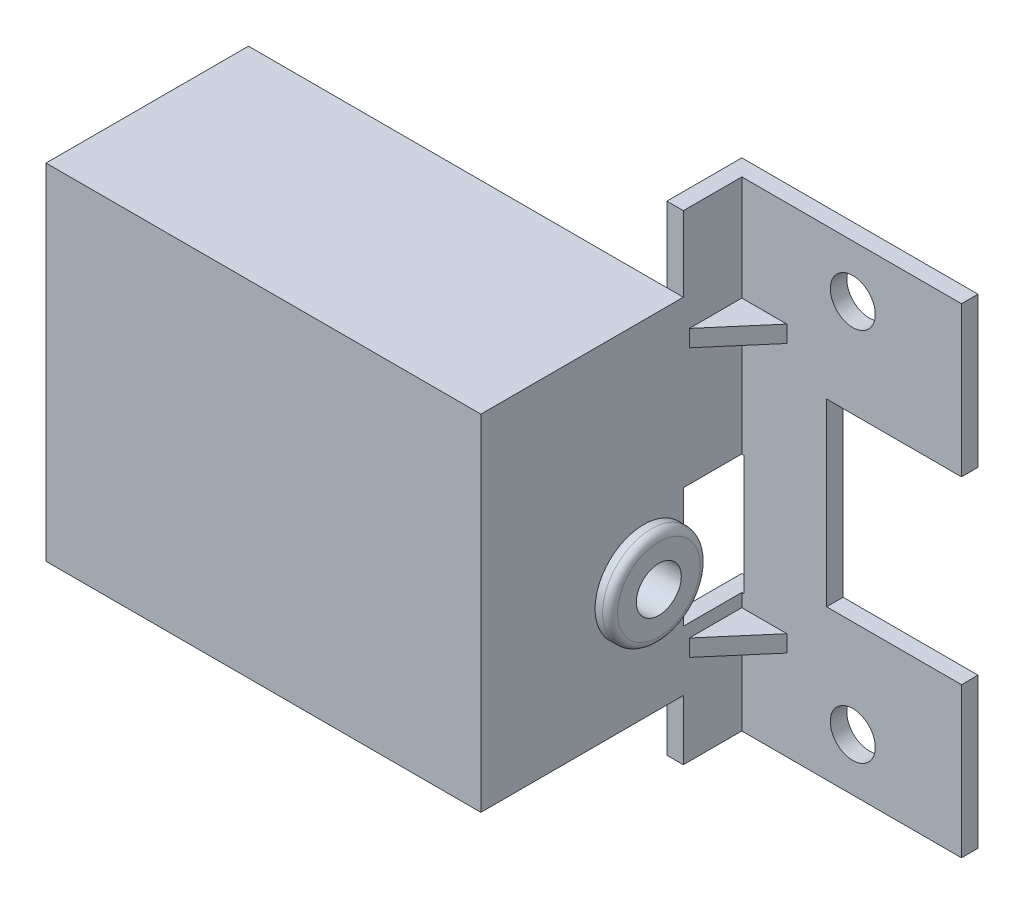
ISO-10303-21;
HEADER;
FILE_DESCRIPTION(('STEP AP214'),'2;1');
FILE_NAME('part.step','',(''),(''),'','','');
FILE_SCHEMA(('AUTOMOTIVE_DESIGN { 1 0 10303 214 1 1 1 1 }'));
ENDSEC;
DATA;
#1=APPLICATION_CONTEXT('core data for automotive mechanical design processes');
#2=APPLICATION_PROTOCOL_DEFINITION('international standard','automotive_design',2000,#1);
#3=PRODUCT_CONTEXT('',#1,'mechanical');
#4=PRODUCT('Part','Part','',(#3));
#5=PRODUCT_RELATED_PRODUCT_CATEGORY('part','',(#4));
#6=PRODUCT_DEFINITION_FORMATION('','',#4);
#7=PRODUCT_DEFINITION_CONTEXT('part definition',#1,'design');
#8=PRODUCT_DEFINITION('design','',#6,#7);
#9=PRODUCT_DEFINITION_SHAPE('','',#8);
#10=(LENGTH_UNIT() NAMED_UNIT(*) SI_UNIT(.MILLI.,.METRE.));
#11=(NAMED_UNIT(*) PLANE_ANGLE_UNIT() SI_UNIT($,.RADIAN.));
#12=(NAMED_UNIT(*) SI_UNIT($,.STERADIAN.) SOLID_ANGLE_UNIT());
#13=UNCERTAINTY_MEASURE_WITH_UNIT(LENGTH_MEASURE(1.E-05),#10,'distance_accuracy_value','');
#14=(GEOMETRIC_REPRESENTATION_CONTEXT(3) GLOBAL_UNCERTAINTY_ASSIGNED_CONTEXT((#13)) GLOBAL_UNIT_ASSIGNED_CONTEXT((#10,
#11,#12)) REPRESENTATION_CONTEXT('',''));
#15=CARTESIAN_POINT('',(0.,0.,0.));
#16=DIRECTION('',(0.,0.,1.));
#17=DIRECTION('',(1.,0.,0.));
#18=AXIS2_PLACEMENT_3D('',#15,#16,#17);
#19=CARTESIAN_POINT('',(-178.5,-10.96820696058,69.62416893118));
#20=DIRECTION('',(1.,0.,0.));
#21=DIRECTION('',(0.,1.,0.));
#22=AXIS2_PLACEMENT_3D('',#19,#20,#21);
#23=PLANE('',#22);
#24=CARTESIAN_POINT('',(-178.5,-7.830932572581,72.77));
#25=DIRECTION('',(1.,0.,0.));
#26=DIRECTION('',(0.,0.,-1.));
#27=AXIS2_PLACEMENT_3D('',#24,#25,#26);
#28=CIRCLE('',#27,3.);
#29=CARTESIAN_POINT('',(-178.5,-7.830932572581,69.77));
#30=VERTEX_POINT('',#29);
#31=EDGE_CURVE('E422',#30,#30,#28,.F.);
#32=ORIENTED_EDGE('',*,*,#31,.F.);
#33=EDGE_LOOP('',(#32));
#34=FACE_BOUND('',#33,.T.);
#35=ADVANCED_FACE('F17',(#34),#23,.T.);
#36=CARTESIAN_POINT('',(-178.5,-7.830932572581,72.77));
#37=DIRECTION('',(1.,0.,0.));
#38=DIRECTION('',(0.,0.,-1.));
#39=AXIS2_PLACEMENT_3D('',#36,#37,#38);
#40=CYLINDRICAL_SURFACE('',#39,3.);
#41=ORIENTED_EDGE('',*,*,#31,.T.);
#42=EDGE_LOOP('',(#41));
#43=FACE_BOUND('',#42,.T.);
#44=CARTESIAN_POINT('',(-168.5,-7.830932572581,72.77));
#45=DIRECTION('',(1.,0.,0.));
#46=DIRECTION('',(0.,0.,-1.));
#47=AXIS2_PLACEMENT_3D('',#44,#45,#46);
#48=CIRCLE('',#47,3.);
#49=CARTESIAN_POINT('',(-168.5,-7.830932572581,69.77));
#50=VERTEX_POINT('',#49);
#51=EDGE_CURVE('E419',#50,#50,#48,.F.);
#52=ORIENTED_EDGE('',*,*,#51,.F.);
#53=EDGE_LOOP('',(#52));
#54=FACE_BOUND('',#53,.T.);
#55=ADVANCED_FACE('F389',(#43,#54),#40,.F.);
#56=CARTESIAN_POINT('',(-168.5,-13.55093257258,67.05));
#57=DIRECTION('',(1.,0.,0.));
#58=DIRECTION('',(0.,1.,0.));
#59=AXIS2_PLACEMENT_3D('',#56,#57,#58);
#60=PLANE('',#59);
#61=ORIENTED_EDGE('',*,*,#51,.T.);
#62=EDGE_LOOP('',(#61));
#63=FACE_BOUND('',#62,.T.);
#64=CARTESIAN_POINT('',(-168.5,-7.830932572581,72.77));
#65=DIRECTION('',(-1.,0.,0.));
#66=DIRECTION('',(0.,-1.,4.41752695030053E-10));
#67=AXIS2_PLACEMENT_3D('',#64,#65,#66);
#68=CIRCLE('',#67,5.50000000000004);
#69=CARTESIAN_POINT('',(-168.5,-2.33093257257978,72.7699999995147));
#70=VERTEX_POINT('',#69);
#71=CARTESIAN_POINT('',(-168.5,-13.3309325725818,72.7700000014584));
#72=VERTEX_POINT('',#71);
#73=EDGE_CURVE('E372',#70,#72,#68,.F.);
#74=ORIENTED_EDGE('',*,*,#73,.T.);
#75=CARTESIAN_POINT('',(-168.5,-7.830932572581,72.77));
#76=DIRECTION('',(-1.,0.,0.));
#77=DIRECTION('',(0.,1.,0.));
#78=AXIS2_PLACEMENT_3D('',#75,#76,#77);
#79=CIRCLE('',#78,5.50000000000303);
#80=EDGE_CURVE('E425',#72,#70,#79,.F.);
#81=ORIENTED_EDGE('',*,*,#80,.T.);
#82=EDGE_LOOP('',(#74,#81));
#83=FACE_BOUND('',#82,.T.);
#84=ADVANCED_FACE('F378',(#63,#83),#60,.T.);
#85=CARTESIAN_POINT('',(-141.2,32.67906742742,59.837274388));
#86=DIRECTION('',(1.,0.,0.));
#87=DIRECTION('',(0.,-1.,0.));
#88=AXIS2_PLACEMENT_3D('',#85,#86,#87);
#89=PLANE('',#88);
#90=DIRECTION('',(0.,-1.,0.));
#91=VECTOR('',#90,1.);
#92=CARTESIAN_POINT('',(-141.2,0.279067427420003,59.7));
#93=LINE('',#92,#91);
#94=CARTESIAN_POINT('',(-141.2,32.27906742742,59.7));
#95=VERTEX_POINT('',#94);
#96=CARTESIAN_POINT('',(-141.2,12.27906742742,59.7));
#97=VERTEX_POINT('',#96);
#98=EDGE_CURVE('E465',#95,#97,#93,.T.);
#99=ORIENTED_EDGE('',*,*,#98,.T.);
#100=DIRECTION('',(0.,0.,1.));
#101=VECTOR('',#100,1.);
#102=CARTESIAN_POINT('',(-141.2,12.27906742742,58.6));
#103=LINE('',#102,#101);
#104=CARTESIAN_POINT('',(-141.2,12.27906742742,57.4999999999992));
#105=VERTEX_POINT('',#104);
#106=EDGE_CURVE('E426',#105,#97,#103,.T.);
#107=ORIENTED_EDGE('',*,*,#106,.F.);
#108=DIRECTION('',(0.,-1.,0.));
#109=VECTOR('',#108,1.);
#110=CARTESIAN_POINT('',(-141.2,0.279067427420003,57.5));
#111=LINE('',#110,#109);
#112=CARTESIAN_POINT('',(-141.2,32.27906742742,57.5));
#113=VERTEX_POINT('',#112);
#114=EDGE_CURVE('E427',#113,#105,#111,.T.);
#115=ORIENTED_EDGE('',*,*,#114,.F.);
#116=DIRECTION('',(0.,0.,-1.));
#117=VECTOR('',#116,1.);
#118=CARTESIAN_POINT('',(-141.2,32.27906742742,62.5));
#119=LINE('',#118,#117);
#120=EDGE_CURVE('E322',#95,#113,#119,.T.);
#121=ORIENTED_EDGE('',*,*,#120,.F.);
#122=EDGE_LOOP('',(#99,#107,#115,#121));
#123=FACE_BOUND('',#122,.T.);
#124=ADVANCED_FACE('F388',(#123),#89,.T.);
#125=CARTESIAN_POINT('',(-140.84,12.27906742742,59.837274388));
#126=DIRECTION('',(0.,-1.,0.));
#127=DIRECTION('',(-1.,0.,0.));
#128=AXIS2_PLACEMENT_3D('',#125,#126,#127);
#129=PLANE('',#128);
#130=DIRECTION('',(-1.,0.,0.));
#131=VECTOR('',#130,1.);
#132=CARTESIAN_POINT('',(-155.85,12.27906742742,59.7));
#133=LINE('',#132,#131);
#134=CARTESIAN_POINT('',(-159.2,12.27906742742,59.7));
#135=VERTEX_POINT('',#134);
#136=EDGE_CURVE('E457',#97,#135,#133,.T.);
#137=ORIENTED_EDGE('',*,*,#136,.T.);
#138=DIRECTION('',(0.,0.,1.));
#139=VECTOR('',#138,1.);
#140=CARTESIAN_POINT('',(-159.2,12.27906742742,58.6));
#141=LINE('',#140,#139);
#142=CARTESIAN_POINT('',(-159.2,12.27906742742,57.4999999999992));
#143=VERTEX_POINT('',#142);
#144=EDGE_CURVE('E438',#143,#135,#141,.T.);
#145=ORIENTED_EDGE('',*,*,#144,.F.);
#146=DIRECTION('',(-1.,0.,0.));
#147=VECTOR('',#146,1.);
#148=CARTESIAN_POINT('',(-156.95,12.27906742742,57.5));
#149=LINE('',#148,#147);
#150=EDGE_CURVE('E429',#105,#143,#149,.T.);
#151=ORIENTED_EDGE('',*,*,#150,.F.);
#152=ORIENTED_EDGE('',*,*,#106,.T.);
#153=EDGE_LOOP('',(#137,#145,#151,#152));
#154=FACE_BOUND('',#153,.T.);
#155=ADVANCED_FACE('F506',(#154),#129,.T.);
#156=CARTESIAN_POINT('',(-159.2,12.75906742742,59.837274388));
#157=DIRECTION('',(1.,0.,0.));
#158=DIRECTION('',(0.,-1.,0.));
#159=AXIS2_PLACEMENT_3D('',#156,#157,#158);
#160=PLANE('',#159);
#161=DIRECTION('',(0.,-1.,0.));
#162=VECTOR('',#161,1.);
#163=CARTESIAN_POINT('',(-159.2,0.279067427420003,59.7));
#164=LINE('',#163,#162);
#165=CARTESIAN_POINT('',(-159.2,-11.72093257258,59.7));
#166=VERTEX_POINT('',#165);
#167=EDGE_CURVE('E450',#135,#166,#164,.T.);
#168=ORIENTED_EDGE('',*,*,#167,.T.);
#169=DIRECTION('',(0.,0.,1.));
#170=VECTOR('',#169,1.);
#171=CARTESIAN_POINT('',(-159.2,-11.72093257258,58.6));
#172=LINE('',#171,#170);
#173=CARTESIAN_POINT('',(-159.2,-11.72093257258,57.4999999999992));
#174=VERTEX_POINT('',#173);
#175=EDGE_CURVE('E431',#174,#166,#172,.T.);
#176=ORIENTED_EDGE('',*,*,#175,.F.);
#177=DIRECTION('',(0.,-1.,0.));
#178=VECTOR('',#177,1.);
#179=CARTESIAN_POINT('',(-159.2,0.279067427420003,57.5));
#180=LINE('',#179,#178);
#181=EDGE_CURVE('E491',#143,#174,#180,.T.);
#182=ORIENTED_EDGE('',*,*,#181,.F.);
#183=ORIENTED_EDGE('',*,*,#144,.T.);
#184=EDGE_LOOP('',(#168,#176,#182,#183));
#185=FACE_BOUND('',#184,.T.);
#186=ADVANCED_FACE('F510',(#185),#160,.T.);
#187=CARTESIAN_POINT('',(-159.56,-11.72093257258,59.837274388));
#188=DIRECTION('',(0.,1.,0.));
#189=DIRECTION('',(1.,0.,0.));
#190=AXIS2_PLACEMENT_3D('',#187,#188,#189);
#191=PLANE('',#190);
#192=DIRECTION('',(1.,0.,0.));
#193=VECTOR('',#192,1.);
#194=CARTESIAN_POINT('',(-155.85,-11.72093257258,59.7));
#195=LINE('',#194,#193);
#196=CARTESIAN_POINT('',(-141.2,-11.72093257258,59.7));
#197=VERTEX_POINT('',#196);
#198=EDGE_CURVE('E446',#166,#197,#195,.T.);
#199=ORIENTED_EDGE('',*,*,#198,.T.);
#200=DIRECTION('',(0.,0.,1.));
#201=VECTOR('',#200,1.);
#202=CARTESIAN_POINT('',(-141.2,-11.72093257258,58.6));
#203=LINE('',#202,#201);
#204=CARTESIAN_POINT('',(-141.2,-11.72093257258,57.4999999999992));
#205=VERTEX_POINT('',#204);
#206=EDGE_CURVE('E428',#205,#197,#203,.T.);
#207=ORIENTED_EDGE('',*,*,#206,.F.);
#208=DIRECTION('',(1.,0.,0.));
#209=VECTOR('',#208,1.);
#210=CARTESIAN_POINT('',(-156.95,-11.72093257258,57.5));
#211=LINE('',#210,#209);
#212=EDGE_CURVE('E485',#174,#205,#211,.T.);
#213=ORIENTED_EDGE('',*,*,#212,.F.);
#214=ORIENTED_EDGE('',*,*,#175,.T.);
#215=EDGE_LOOP('',(#199,#207,#213,#214));
#216=FACE_BOUND('',#215,.T.);
#217=ADVANCED_FACE('F514',(#216),#191,.T.);
#218=CARTESIAN_POINT('',(-141.2,-11.32093257258,59.837274388));
#219=DIRECTION('',(1.,0.,0.));
#220=DIRECTION('',(0.,-1.,0.));
#221=AXIS2_PLACEMENT_3D('',#218,#219,#220);
#222=PLANE('',#221);
#223=DIRECTION('',(0.,-1.,0.));
#224=VECTOR('',#223,1.);
#225=CARTESIAN_POINT('',(-141.2,0.279067427420003,59.7));
#226=LINE('',#225,#224);
#227=CARTESIAN_POINT('',(-141.2,-31.72093257258,59.7));
#228=VERTEX_POINT('',#227);
#229=EDGE_CURVE('E449',#197,#228,#226,.T.);
#230=ORIENTED_EDGE('',*,*,#229,.T.);
#231=DIRECTION('',(0.,0.,1.));
#232=VECTOR('',#231,1.);
#233=CARTESIAN_POINT('',(-141.2,-31.72093257258,62.5));
#234=LINE('',#233,#232);
#235=CARTESIAN_POINT('',(-141.2,-31.72093257258,57.5));
#236=VERTEX_POINT('',#235);
#237=EDGE_CURVE('E304',#236,#228,#234,.T.);
#238=ORIENTED_EDGE('',*,*,#237,.F.);
#239=DIRECTION('',(0.,-1.,0.));
#240=VECTOR('',#239,1.);
#241=CARTESIAN_POINT('',(-141.2,0.279067427420003,57.5));
#242=LINE('',#241,#240);
#243=EDGE_CURVE('E418',#205,#236,#242,.T.);
#244=ORIENTED_EDGE('',*,*,#243,.F.);
#245=ORIENTED_EDGE('',*,*,#206,.T.);
#246=EDGE_LOOP('',(#230,#238,#244,#245));
#247=FACE_BOUND('',#246,.T.);
#248=ADVANCED_FACE('F522',(#247),#222,.T.);
#249=CARTESIAN_POINT('',(-155.7,25.27906742742,59.7000000000025));
#250=DIRECTION('',(0.,0.,-1.));
#251=DIRECTION('',(-1.,0.,0.));
#252=AXIS2_PLACEMENT_3D('',#249,#250,#251);
#253=CYLINDRICAL_SURFACE('',#252,2.99999999999996);
#254=CARTESIAN_POINT('',(-155.7,25.27906742742,59.7000000000025));
#255=DIRECTION('',(0.,0.,-1.));
#256=DIRECTION('',(-1.,0.,0.));
#257=AXIS2_PLACEMENT_3D('',#254,#255,#256);
#258=CIRCLE('',#257,2.99999999999996);
#259=CARTESIAN_POINT('',(-158.7,25.27906742742,59.7000000000025));
#260=VERTEX_POINT('',#259);
#261=EDGE_CURVE('E271',#260,#260,#258,.F.);
#262=ORIENTED_EDGE('',*,*,#261,.T.);
#263=EDGE_LOOP('',(#262));
#264=FACE_BOUND('',#263,.T.);
#265=CARTESIAN_POINT('',(-155.7,25.27906742742,57.4999999999974));
#266=DIRECTION('',(0.,0.,-1.));
#267=DIRECTION('',(-1.,0.,0.));
#268=AXIS2_PLACEMENT_3D('',#265,#266,#267);
#269=CIRCLE('',#268,2.99999999999996);
#270=CARTESIAN_POINT('',(-158.7,25.27906742742,57.4999999999974));
#271=VERTEX_POINT('',#270);
#272=EDGE_CURVE('E283',#271,#271,#269,.F.);
#273=ORIENTED_EDGE('',*,*,#272,.F.);
#274=EDGE_LOOP('',(#273));
#275=FACE_BOUND('',#274,.T.);
#276=ADVANCED_FACE('F981',(#264,#275),#253,.F.);
#277=CARTESIAN_POINT('',(-155.7,-24.72093257258,59.7000000000025));
#278=DIRECTION('',(0.,0.,-1.));
#279=DIRECTION('',(-1.,0.,0.));
#280=AXIS2_PLACEMENT_3D('',#277,#278,#279);
#281=CYLINDRICAL_SURFACE('',#280,2.99999999999996);
#282=CARTESIAN_POINT('',(-155.7,-24.72093257258,59.7000000000025));
#283=DIRECTION('',(0.,0.,-1.));
#284=DIRECTION('',(-1.,0.,0.));
#285=AXIS2_PLACEMENT_3D('',#282,#283,#284);
#286=CIRCLE('',#285,2.99999999999996);
#287=CARTESIAN_POINT('',(-158.7,-24.72093257258,59.7000000000025));
#288=VERTEX_POINT('',#287);
#289=EDGE_CURVE('E341',#288,#288,#286,.F.);
#290=ORIENTED_EDGE('',*,*,#289,.T.);
#291=EDGE_LOOP('',(#290));
#292=FACE_BOUND('',#291,.T.);
#293=CARTESIAN_POINT('',(-155.7,-24.72093257258,57.4999999999974));
#294=DIRECTION('',(0.,0.,-1.));
#295=DIRECTION('',(-1.,0.,0.));
#296=AXIS2_PLACEMENT_3D('',#293,#294,#295);
#297=CIRCLE('',#296,2.99999999999996);
#298=CARTESIAN_POINT('',(-158.7,-24.72093257258,57.4999999999974));
#299=VERTEX_POINT('',#298);
#300=EDGE_CURVE('E415',#299,#299,#297,.F.);
#301=ORIENTED_EDGE('',*,*,#300,.F.);
#302=EDGE_LOOP('',(#301));
#303=FACE_BOUND('',#302,.T.);
#304=ADVANCED_FACE('F352',(#292,#303),#281,.F.);
#305=CARTESIAN_POINT('',(-169.5,-7.830932572581,72.77));
#306=DIRECTION('',(1.,0.,0.));
#307=DIRECTION('',(0.,-0.999633874046563,0.0270576765199843));
#308=AXIS2_PLACEMENT_3D('',#305,#306,#307);
#309=TOROIDAL_SURFACE('',#308,5.5000000000029,1.);
#310=CARTESIAN_POINT('',(-169.5,-7.830932572581,72.77));
#311=DIRECTION('',(1.,0.,0.));
#312=DIRECTION('',(0.,1.,0.));
#313=AXIS2_PLACEMENT_3D('',#310,#311,#312);
#314=CIRCLE('',#313,6.5);
#315=CARTESIAN_POINT('',(-169.5,-1.330932572581,72.77));
#316=VERTEX_POINT('',#315);
#317=EDGE_CURVE('E338',#316,#316,#314,.T.);
#318=ORIENTED_EDGE('',*,*,#317,.T.);
#319=EDGE_LOOP('',(#318));
#320=FACE_BOUND('',#319,.T.);
#321=ORIENTED_EDGE('',*,*,#73,.F.);
#322=ORIENTED_EDGE('',*,*,#80,.F.);
#323=EDGE_LOOP('',(#321,#322));
#324=FACE_BOUND('',#323,.T.);
#325=ADVANCED_FACE('F346',(#320,#324),#309,.T.);
#326=CARTESIAN_POINT('',(-173.33,-33.00093257258,57.5));
#327=DIRECTION('',(0.,0.,-1.));
#328=DIRECTION('',(0.,1.,0.));
#329=AXIS2_PLACEMENT_3D('',#326,#327,#328);
#330=PLANE('',#329);
#331=ORIENTED_EDGE('',*,*,#272,.T.);
#332=EDGE_LOOP('',(#331));
#333=FACE_BOUND('',#332,.T.);
#334=ORIENTED_EDGE('',*,*,#300,.T.);
#335=EDGE_LOOP('',(#334));
#336=FACE_BOUND('',#335,.T.);
#337=DIRECTION('',(1.,0.,0.));
#338=VECTOR('',#337,1.);
#339=CARTESIAN_POINT('',(-171.45,-15.72093257258,57.5));
#340=LINE('',#339,#338);
#341=CARTESIAN_POINT('',(-172.7,-15.72093257258,57.5));
#342=VERTEX_POINT('',#341);
#343=CARTESIAN_POINT('',(-170.2,-15.72093257258,57.4999999999992));
#344=VERTEX_POINT('',#343);
#345=EDGE_CURVE('E279',#342,#344,#340,.T.);
#346=ORIENTED_EDGE('',*,*,#345,.T.);
#347=DIRECTION('',(0.,1.,0.));
#348=VECTOR('',#347,1.);
#349=CARTESIAN_POINT('',(-170.2,-7.72093257258055,57.4999999999975));
#350=LINE('',#349,#348);
#351=CARTESIAN_POINT('',(-170.2,0.279067427418907,57.4999999999992));
#352=VERTEX_POINT('',#351);
#353=EDGE_CURVE('E245',#344,#352,#350,.T.);
#354=ORIENTED_EDGE('',*,*,#353,.T.);
#355=DIRECTION('',(-1.,0.,0.));
#356=VECTOR('',#355,1.);
#357=CARTESIAN_POINT('',(-171.45,0.2790674274189,57.5));
#358=LINE('',#357,#356);
#359=CARTESIAN_POINT('',(-172.7,0.279067427419636,57.5));
#360=VERTEX_POINT('',#359);
#361=EDGE_CURVE('E330',#352,#360,#358,.T.);
#362=ORIENTED_EDGE('',*,*,#361,.T.);
#363=DIRECTION('',(0.,1.,0.));
#364=VECTOR('',#363,1.);
#365=CARTESIAN_POINT('',(-172.7,0.279067427420003,57.5));
#366=LINE('',#365,#364);
#367=CARTESIAN_POINT('',(-172.7,32.27906742742,57.5));
#368=VERTEX_POINT('',#367);
#369=EDGE_CURVE('E318',#360,#368,#366,.T.);
#370=ORIENTED_EDGE('',*,*,#369,.T.);
#371=DIRECTION('',(-1.,0.,0.));
#372=VECTOR('',#371,1.);
#373=CARTESIAN_POINT('',(-156.95,32.27906742742,57.5));
#374=LINE('',#373,#372);
#375=EDGE_CURVE('E226',#113,#368,#374,.T.);
#376=ORIENTED_EDGE('',*,*,#375,.F.);
#377=ORIENTED_EDGE('',*,*,#114,.T.);
#378=ORIENTED_EDGE('',*,*,#150,.T.);
#379=ORIENTED_EDGE('',*,*,#181,.T.);
#380=ORIENTED_EDGE('',*,*,#212,.T.);
#381=ORIENTED_EDGE('',*,*,#243,.T.);
#382=DIRECTION('',(1.,0.,0.));
#383=VECTOR('',#382,1.);
#384=CARTESIAN_POINT('',(-156.95,-31.72093257258,57.5));
#385=LINE('',#384,#383);
#386=CARTESIAN_POINT('',(-172.7,-31.72093257258,57.5));
#387=VERTEX_POINT('',#386);
#388=EDGE_CURVE('E301',#387,#236,#385,.T.);
#389=ORIENTED_EDGE('',*,*,#388,.F.);
#390=DIRECTION('',(0.,1.,0.));
#391=VECTOR('',#390,1.);
#392=CARTESIAN_POINT('',(-172.7,0.279067427420003,57.5));
#393=LINE('',#392,#391);
#394=EDGE_CURVE('E291',#387,#342,#393,.T.);
#395=ORIENTED_EDGE('',*,*,#394,.T.);
#396=EDGE_LOOP('',(#346,#354,#362,#370,#376,#377,#378,#379,#380,#381,#389,#395));
#397=FACE_BOUND('',#396,.T.);
#398=ADVANCED_FACE('F351',(#333,#336,#397),#330,.T.);
#399=CARTESIAN_POINT('',(-170.2,0.5990674274189,59.837274388));
#400=DIRECTION('',(1.,0.,0.));
#401=DIRECTION('',(0.,-1.,0.));
#402=AXIS2_PLACEMENT_3D('',#399,#400,#401);
#403=PLANE('',#402);
#404=DIRECTION('',(0.,1.,0.));
#405=VECTOR('',#404,1.);
#406=CARTESIAN_POINT('',(-170.2,0.279067427420003,59.7));
#407=LINE('',#406,#405);
#408=CARTESIAN_POINT('',(-170.2,-15.72093257258,59.7));
#409=VERTEX_POINT('',#408);
#410=CARTESIAN_POINT('',(-170.2,0.279067427419267,59.7));
#411=VERTEX_POINT('',#410);
#412=EDGE_CURVE('E269',#409,#411,#407,.T.);
#413=ORIENTED_EDGE('',*,*,#412,.T.);
#414=DIRECTION('',(0.,0.,-1.));
#415=VECTOR('',#414,1.);
#416=CARTESIAN_POINT('',(-170.199999999998,0.2790674274189,62.5));
#417=LINE('',#416,#415);
#418=EDGE_CURVE('E265',#411,#352,#417,.T.);
#419=ORIENTED_EDGE('',*,*,#418,.T.);
#420=ORIENTED_EDGE('',*,*,#353,.F.);
#421=DIRECTION('',(0.,0.,1.));
#422=VECTOR('',#421,1.);
#423=CARTESIAN_POINT('',(-170.199999999998,-15.72093257258,62.5));
#424=LINE('',#423,#422);
#425=EDGE_CURVE('E275',#344,#409,#424,.T.);
#426=ORIENTED_EDGE('',*,*,#425,.T.);
#427=EDGE_LOOP('',(#413,#419,#420,#426));
#428=FACE_BOUND('',#427,.T.);
#429=ADVANCED_FACE('F753',(#428),#403,.F.);
#430=CARTESIAN_POINT('',(-170.637274388,16.03720423358,66.84));
#431=DIRECTION('',(0.,-1.,0.));
#432=DIRECTION('',(0.,0.,-1.));
#433=AXIS2_PLACEMENT_3D('',#430,#431,#432);
#434=PLANE('',#433);
#435=DIRECTION('',(0.,0.,1.));
#436=VECTOR('',#435,1.);
#437=CARTESIAN_POINT('',(-170.5,16.03720423359,77.1));
#438=LINE('',#437,#436);
#439=CARTESIAN_POINT('',(-170.5,16.03720423359,59.7));
#440=VERTEX_POINT('',#439);
#441=CARTESIAN_POINT('',(-170.5,16.03720423359,66.7));
#442=VERTEX_POINT('',#441);
#443=EDGE_CURVE('E214',#440,#442,#438,.T.);
#444=ORIENTED_EDGE('',*,*,#443,.F.);
#445=DIRECTION('',(1.,0.,0.));
#446=VECTOR('',#445,1.);
#447=CARTESIAN_POINT('',(-155.85,16.03720423359,59.7));
#448=LINE('',#447,#446);
#449=CARTESIAN_POINT('',(-164.5,16.03720423359,59.7));
#450=VERTEX_POINT('',#449);
#451=EDGE_CURVE('E256',#440,#450,#448,.T.);
#452=ORIENTED_EDGE('',*,*,#451,.T.);
#453=DIRECTION('',(-0.650791373455968,0.,0.759256602365297));
#454=VECTOR('',#453,1.);
#455=CARTESIAN_POINT('',(-167.5,16.03720423359,63.2));
#456=LINE('',#455,#454);
#457=EDGE_CURVE('E227',#450,#442,#456,.T.);
#458=ORIENTED_EDGE('',*,*,#457,.T.);
#459=EDGE_LOOP('',(#444,#452,#458));
#460=FACE_BOUND('',#459,.T.);
#461=ADVANCED_FACE('F751',(#460),#434,.T.);
#462=CARTESIAN_POINT('',(-170.62,19.03906742742,66.84));
#463=DIRECTION('',(-0.759256602365295,0.,-0.65079137345597));
#464=DIRECTION('',(0.65079137345597,0.,-0.759256602365295));
#465=AXIS2_PLACEMENT_3D('',#462,#463,#464);
#466=PLANE('',#465);
#467=ORIENTED_EDGE('',*,*,#457,.F.);
#468=DIRECTION('',(0.,1.,0.));
#469=VECTOR('',#468,1.);
#470=CARTESIAN_POINT('',(-164.5,0.279067427420003,59.7));
#471=LINE('',#470,#469);
#472=CARTESIAN_POINT('',(-164.5,18.27906742742,59.7));
#473=VERTEX_POINT('',#472);
#474=EDGE_CURVE('E223',#450,#473,#471,.T.);
#475=ORIENTED_EDGE('',*,*,#474,.T.);
#476=DIRECTION('',(0.65079137345632,0.,-0.759256602364996));
#477=VECTOR('',#476,1.);
#478=CARTESIAN_POINT('',(-170.500000000003,18.27906742742,66.7));
#479=LINE('',#478,#477);
#480=CARTESIAN_POINT('',(-170.5,18.27906742742,66.6999999999984));
#481=VERTEX_POINT('',#480);
#482=EDGE_CURVE('E220',#481,#473,#479,.T.);
#483=ORIENTED_EDGE('',*,*,#482,.F.);
#484=DIRECTION('',(0.,1.,0.));
#485=VECTOR('',#484,1.);
#486=CARTESIAN_POINT('',(-170.5,0.279067427420003,66.7));
#487=LINE('',#486,#485);
#488=EDGE_CURVE('E205',#442,#481,#487,.T.);
#489=ORIENTED_EDGE('',*,*,#488,.F.);
#490=EDGE_LOOP('',(#467,#475,#483,#489));
#491=FACE_BOUND('',#490,.T.);
#492=ADVANCED_FACE('F221',(#491),#466,.F.);
#493=CARTESIAN_POINT('',(-170.637274388,18.27906742742,59.56));
#494=DIRECTION('',(0.,1.,0.));
#495=DIRECTION('',(0.,0.,1.));
#496=AXIS2_PLACEMENT_3D('',#493,#494,#495);
#497=PLANE('',#496);
#498=DIRECTION('',(-1.,0.,0.));
#499=VECTOR('',#498,1.);
#500=CARTESIAN_POINT('',(-155.85,18.27906742742,59.7));
#501=LINE('',#500,#499);
#502=CARTESIAN_POINT('',(-170.5,18.27906742742,59.7));
#503=VERTEX_POINT('',#502);
#504=EDGE_CURVE('E230',#473,#503,#501,.T.);
#505=ORIENTED_EDGE('',*,*,#504,.T.);
#506=DIRECTION('',(0.,0.,-1.));
#507=VECTOR('',#506,1.);
#508=CARTESIAN_POINT('',(-170.5,18.27906742742,77.1));
#509=LINE('',#508,#507);
#510=EDGE_CURVE('E210',#481,#503,#509,.T.);
#511=ORIENTED_EDGE('',*,*,#510,.F.);
#512=ORIENTED_EDGE('',*,*,#482,.T.);
#513=EDGE_LOOP('',(#505,#511,#512));
#514=FACE_BOUND('',#513,.T.);
#515=ADVANCED_FACE('F229',(#514),#497,.T.);
#516=CARTESIAN_POINT('',(-173.33,32.27906742742,57.3));
#517=DIRECTION('',(0.,1.,0.));
#518=DIRECTION('',(0.,0.,1.));
#519=AXIS2_PLACEMENT_3D('',#516,#517,#518);
#520=PLANE('',#519);
#521=DIRECTION('',(1.,0.,0.));
#522=VECTOR('',#521,1.);
#523=CARTESIAN_POINT('',(-155.85,32.27906742742,59.7));
#524=LINE('',#523,#522);
#525=CARTESIAN_POINT('',(-170.5,32.27906742742,59.7));
#526=VERTEX_POINT('',#525);
#527=EDGE_CURVE('E473',#526,#95,#524,.T.);
#528=ORIENTED_EDGE('',*,*,#527,.T.);
#529=ORIENTED_EDGE('',*,*,#120,.T.);
#530=ORIENTED_EDGE('',*,*,#375,.T.);
#531=DIRECTION('',(0.,0.,1.));
#532=VECTOR('',#531,1.);
#533=CARTESIAN_POINT('',(-172.7,32.27906742742,62.5));
#534=LINE('',#533,#532);
#535=CARTESIAN_POINT('',(-172.7,32.27906742742,67.5));
#536=VERTEX_POINT('',#535);
#537=EDGE_CURVE('E314',#368,#536,#534,.T.);
#538=ORIENTED_EDGE('',*,*,#537,.T.);
#539=DIRECTION('',(-1.,0.,0.));
#540=VECTOR('',#539,1.);
#541=CARTESIAN_POINT('',(-171.6,32.27906742742,67.5));
#542=LINE('',#541,#540);
#543=CARTESIAN_POINT('',(-170.5,32.27906742742,67.5));
#544=VERTEX_POINT('',#543);
#545=EDGE_CURVE('E478',#544,#536,#542,.T.);
#546=ORIENTED_EDGE('',*,*,#545,.F.);
#547=DIRECTION('',(0.,0.,1.));
#548=VECTOR('',#547,1.);
#549=CARTESIAN_POINT('',(-170.5,32.27906742742,77.1));
#550=LINE('',#549,#548);
#551=EDGE_CURVE('E234',#526,#544,#550,.T.);
#552=ORIENTED_EDGE('',*,*,#551,.F.);
#553=EDGE_LOOP('',(#528,#529,#530,#538,#546,#552));
#554=FACE_BOUND('',#553,.T.);
#555=ADVANCED_FACE('F594',(#554),#520,.T.);
#556=CARTESIAN_POINT('',(-172.837274388,33.55906742742,67.5));
#557=DIRECTION('',(0.,0.,1.));
#558=DIRECTION('',(0.,-1.,0.));
#559=AXIS2_PLACEMENT_3D('',#556,#557,#558);
#560=PLANE('',#559);
#561=ORIENTED_EDGE('',*,*,#545,.T.);
#562=DIRECTION('',(0.,-1.,0.));
#563=VECTOR('',#562,1.);
#564=CARTESIAN_POINT('',(-172.7,0.279067427420003,67.5));
#565=LINE('',#564,#563);
#566=CARTESIAN_POINT('',(-172.7,22.27906742742,67.5));
#567=VERTEX_POINT('',#566);
#568=EDGE_CURVE('E317',#536,#567,#565,.T.);
#569=ORIENTED_EDGE('',*,*,#568,.T.);
#570=DIRECTION('',(-1.,0.,0.));
#571=VECTOR('',#570,1.);
#572=CARTESIAN_POINT('',(-199.5,22.27906742742,67.5));
#573=LINE('',#572,#571);
#574=CARTESIAN_POINT('',(-170.5,22.27906742742,67.5));
#575=VERTEX_POINT('',#574);
#576=EDGE_CURVE('E575',#575,#567,#573,.T.);
#577=ORIENTED_EDGE('',*,*,#576,.F.);
#578=DIRECTION('',(0.,-1.,0.));
#579=VECTOR('',#578,1.);
#580=CARTESIAN_POINT('',(-170.5,0.279067427420003,67.5));
#581=LINE('',#580,#579);
#582=EDGE_CURVE('E571',#544,#575,#581,.T.);
#583=ORIENTED_EDGE('',*,*,#582,.F.);
#584=EDGE_LOOP('',(#561,#569,#577,#583));
#585=FACE_BOUND('',#584,.T.);
#586=ADVANCED_FACE('F606',(#585),#560,.T.);
#587=CARTESIAN_POINT('',(-229.66,-24.64093257258,94.5));
#588=DIRECTION('',(0.,0.,1.));
#589=DIRECTION('',(1.,0.,0.));
#590=AXIS2_PLACEMENT_3D('',#587,#588,#589);
#591=PLANE('',#590);
#592=DIRECTION('',(0.,-1.,0.));
#593=VECTOR('',#592,1.);
#594=CARTESIAN_POINT('',(-170.5,0.279067427420003,94.5));
#595=LINE('',#594,#593);
#596=CARTESIAN_POINT('',(-170.5,22.27906742742,94.5));
#597=VERTEX_POINT('',#596);
#598=CARTESIAN_POINT('',(-170.5,-23.72093257258,94.5));
#599=VERTEX_POINT('',#598);
#600=EDGE_CURVE('E556',#597,#599,#595,.T.);
#601=ORIENTED_EDGE('',*,*,#600,.F.);
#602=DIRECTION('',(1.,0.,0.));
#603=VECTOR('',#602,1.);
#604=CARTESIAN_POINT('',(-199.5,22.27906742742,94.5));
#605=LINE('',#604,#603);
#606=CARTESIAN_POINT('',(-228.5,22.27906742742,94.5));
#607=VERTEX_POINT('',#606);
#608=EDGE_CURVE('E311',#607,#597,#605,.T.);
#609=ORIENTED_EDGE('',*,*,#608,.F.);
#610=DIRECTION('',(0.,1.,0.));
#611=VECTOR('',#610,1.);
#612=CARTESIAN_POINT('',(-228.5,-0.72093257258,94.5));
#613=LINE('',#612,#611);
#614=CARTESIAN_POINT('',(-228.5,-23.72093257258,94.5));
#615=VERTEX_POINT('',#614);
#616=EDGE_CURVE('E308',#615,#607,#613,.T.);
#617=ORIENTED_EDGE('',*,*,#616,.F.);
#618=DIRECTION('',(-1.,0.,0.));
#619=VECTOR('',#618,1.);
#620=CARTESIAN_POINT('',(-199.5,-23.72093257258,94.5));
#621=LINE('',#620,#619);
#622=EDGE_CURVE('E559',#599,#615,#621,.T.);
#623=ORIENTED_EDGE('',*,*,#622,.F.);
#624=EDGE_LOOP('',(#601,#609,#617,#623));
#625=FACE_BOUND('',#624,.T.);
#626=ADVANCED_FACE('F618',(#625),#591,.T.);
#627=CARTESIAN_POINT('',(-172.837274388,33.55906742742,67.5));
#628=DIRECTION('',(0.,0.,1.));
#629=DIRECTION('',(0.,-1.,0.));
#630=AXIS2_PLACEMENT_3D('',#627,#628,#629);
#631=PLANE('',#630);
#632=DIRECTION('',(-1.,0.,0.));
#633=VECTOR('',#632,1.);
#634=CARTESIAN_POINT('',(-156.95,-31.72093257258,67.5));
#635=LINE('',#634,#633);
#636=CARTESIAN_POINT('',(-170.5,-31.72093257258,67.5));
#637=VERTEX_POINT('',#636);
#638=CARTESIAN_POINT('',(-172.7,-31.72093257258,67.5));
#639=VERTEX_POINT('',#638);
#640=EDGE_CURVE('E305',#637,#639,#635,.T.);
#641=ORIENTED_EDGE('',*,*,#640,.F.);
#642=DIRECTION('',(0.,-1.,0.));
#643=VECTOR('',#642,1.);
#644=CARTESIAN_POINT('',(-170.5,0.279067427420003,67.5));
#645=LINE('',#644,#643);
#646=CARTESIAN_POINT('',(-170.5,-23.72093257258,67.5));
#647=VERTEX_POINT('',#646);
#648=EDGE_CURVE('E544',#647,#637,#645,.T.);
#649=ORIENTED_EDGE('',*,*,#648,.F.);
#650=DIRECTION('',(1.,0.,0.));
#651=VECTOR('',#650,1.);
#652=CARTESIAN_POINT('',(-199.5,-23.72093257258,67.5));
#653=LINE('',#652,#651);
#654=CARTESIAN_POINT('',(-172.7,-23.72093257258,67.5));
#655=VERTEX_POINT('',#654);
#656=EDGE_CURVE('E562',#655,#647,#653,.T.);
#657=ORIENTED_EDGE('',*,*,#656,.F.);
#658=DIRECTION('',(0.,-1.,0.));
#659=VECTOR('',#658,1.);
#660=CARTESIAN_POINT('',(-172.7,0.279067427420003,67.5));
#661=LINE('',#660,#659);
#662=EDGE_CURVE('E298',#655,#639,#661,.T.);
#663=ORIENTED_EDGE('',*,*,#662,.T.);
#664=EDGE_LOOP('',(#641,#649,#657,#663));
#665=FACE_BOUND('',#664,.T.);
#666=ADVANCED_FACE('F629',(#665),#631,.T.);
#667=CARTESIAN_POINT('',(-173.33,-31.72093257258,67.7));
#668=DIRECTION('',(0.,-1.,0.));
#669=DIRECTION('',(0.,0.,-1.));
#670=AXIS2_PLACEMENT_3D('',#667,#668,#669);
#671=PLANE('',#670);
#672=ORIENTED_EDGE('',*,*,#237,.T.);
#673=DIRECTION('',(-1.,0.,0.));
#674=VECTOR('',#673,1.);
#675=CARTESIAN_POINT('',(-155.85,-31.72093257258,59.7));
#676=LINE('',#675,#674);
#677=CARTESIAN_POINT('',(-170.5,-31.72093257258,59.7));
#678=VERTEX_POINT('',#677);
#679=EDGE_CURVE('E529',#228,#678,#676,.T.);
#680=ORIENTED_EDGE('',*,*,#679,.T.);
#681=DIRECTION('',(0.,0.,-1.));
#682=VECTOR('',#681,1.);
#683=CARTESIAN_POINT('',(-170.5,-31.72093257258,77.1));
#684=LINE('',#683,#682);
#685=EDGE_CURVE('E541',#637,#678,#684,.T.);
#686=ORIENTED_EDGE('',*,*,#685,.F.);
#687=ORIENTED_EDGE('',*,*,#640,.T.);
#688=DIRECTION('',(0.,0.,-1.));
#689=VECTOR('',#688,1.);
#690=CARTESIAN_POINT('',(-172.7,-31.72093257258,62.5));
#691=LINE('',#690,#689);
#692=EDGE_CURVE('E293',#639,#387,#691,.T.);
#693=ORIENTED_EDGE('',*,*,#692,.T.);
#694=ORIENTED_EDGE('',*,*,#388,.T.);
#695=EDGE_LOOP('',(#672,#680,#686,#687,#693,#694));
#696=FACE_BOUND('',#695,.T.);
#697=ADVANCED_FACE('F518',(#696),#671,.T.);
#698=CARTESIAN_POINT('',(-170.637274388,-19.72093257258,66.84));
#699=DIRECTION('',(0.,-1.,0.));
#700=DIRECTION('',(0.,0.,-1.));
#701=AXIS2_PLACEMENT_3D('',#698,#699,#700);
#702=PLANE('',#701);
#703=DIRECTION('',(0.,0.,1.));
#704=VECTOR('',#703,1.);
#705=CARTESIAN_POINT('',(-170.5,-19.72093257258,77.1));
#706=LINE('',#705,#704);
#707=CARTESIAN_POINT('',(-170.5,-19.72093257258,59.7));
#708=VERTEX_POINT('',#707);
#709=CARTESIAN_POINT('',(-170.5,-19.72093257258,66.7));
#710=VERTEX_POINT('',#709);
#711=EDGE_CURVE('E634',#708,#710,#706,.T.);
#712=ORIENTED_EDGE('',*,*,#711,.F.);
#713=DIRECTION('',(1.,0.,0.));
#714=VECTOR('',#713,1.);
#715=CARTESIAN_POINT('',(-155.85,-19.72093257258,59.7));
#716=LINE('',#715,#714);
#717=CARTESIAN_POINT('',(-164.5,-19.72093257258,59.7));
#718=VERTEX_POINT('',#717);
#719=EDGE_CURVE('E530',#708,#718,#716,.T.);
#720=ORIENTED_EDGE('',*,*,#719,.T.);
#721=DIRECTION('',(-0.65079137345597,0.,0.759256602365295));
#722=VECTOR('',#721,1.);
#723=CARTESIAN_POINT('',(-167.5,-19.7209325725801,63.2));
#724=LINE('',#723,#722);
#725=EDGE_CURVE('E411',#718,#710,#724,.T.);
#726=ORIENTED_EDGE('',*,*,#725,.T.);
#727=EDGE_LOOP('',(#712,#720,#726));
#728=FACE_BOUND('',#727,.T.);
#729=ADVANCED_FACE('F637',(#728),#702,.T.);
#730=CARTESIAN_POINT('',(-170.62,19.03906742742,66.84));
#731=DIRECTION('',(-0.759256602365295,0.,-0.65079137345597));
#732=DIRECTION('',(0.65079137345597,0.,-0.759256602365295));
#733=AXIS2_PLACEMENT_3D('',#730,#731,#732);
#734=PLANE('',#733);
#735=ORIENTED_EDGE('',*,*,#725,.F.);
#736=DIRECTION('',(0.,1.,0.));
#737=VECTOR('',#736,1.);
#738=CARTESIAN_POINT('',(-164.5,0.279067427420003,59.7));
#739=LINE('',#738,#737);
#740=CARTESIAN_POINT('',(-164.5,-17.47906937875,59.7));
#741=VERTEX_POINT('',#740);
#742=EDGE_CURVE('E344',#718,#741,#739,.T.);
#743=ORIENTED_EDGE('',*,*,#742,.T.);
#744=DIRECTION('',(0.65079137345632,0.,-0.759256602364996));
#745=VECTOR('',#744,1.);
#746=CARTESIAN_POINT('',(-170.500000000003,-17.47906937875,66.7));
#747=LINE('',#746,#745);
#748=CARTESIAN_POINT('',(-170.5,-17.4790693787475,66.7));
#749=VERTEX_POINT('',#748);
#750=EDGE_CURVE('E259',#749,#741,#747,.T.);
#751=ORIENTED_EDGE('',*,*,#750,.F.);
#752=DIRECTION('',(0.,1.,0.));
#753=VECTOR('',#752,1.);
#754=CARTESIAN_POINT('',(-170.5,0.279067427420003,66.7));
#755=LINE('',#754,#753);
#756=EDGE_CURVE('E639',#710,#749,#755,.T.);
#757=ORIENTED_EDGE('',*,*,#756,.F.);
#758=EDGE_LOOP('',(#735,#743,#751,#757));
#759=FACE_BOUND('',#758,.T.);
#760=ADVANCED_FACE('F804',(#759),#734,.F.);
#761=CARTESIAN_POINT('',(-170.637274388,-17.47906937875,59.56));
#762=DIRECTION('',(0.,1.,0.));
#763=DIRECTION('',(0.,0.,1.));
#764=AXIS2_PLACEMENT_3D('',#761,#762,#763);
#765=PLANE('',#764);
#766=DIRECTION('',(-1.,0.,0.));
#767=VECTOR('',#766,1.);
#768=CARTESIAN_POINT('',(-155.85,-17.47906937875,59.7));
#769=LINE('',#768,#767);
#770=CARTESIAN_POINT('',(-170.5,-17.4790693787466,59.7));
#771=VERTEX_POINT('',#770);
#772=EDGE_CURVE('E272',#741,#771,#769,.T.);
#773=ORIENTED_EDGE('',*,*,#772,.T.);
#774=DIRECTION('',(0.,0.,-1.));
#775=VECTOR('',#774,1.);
#776=CARTESIAN_POINT('',(-170.5,-17.479069378745,77.1));
#777=LINE('',#776,#775);
#778=EDGE_CURVE('E641',#749,#771,#777,.T.);
#779=ORIENTED_EDGE('',*,*,#778,.F.);
#780=ORIENTED_EDGE('',*,*,#750,.T.);
#781=EDGE_LOOP('',(#773,#779,#780));
#782=FACE_BOUND('',#781,.T.);
#783=ADVANCED_FACE('F800',(#782),#765,.T.);
#784=CARTESIAN_POINT('',(-140.614,-33.00093257258,59.7));
#785=DIRECTION('',(0.,0.,-1.));
#786=DIRECTION('',(-1.,0.,0.));
#787=AXIS2_PLACEMENT_3D('',#784,#785,#786);
#788=PLANE('',#787);
#789=ORIENTED_EDGE('',*,*,#289,.F.);
#790=EDGE_LOOP('',(#789));
#791=FACE_BOUND('',#790,.T.);
#792=ORIENTED_EDGE('',*,*,#261,.F.);
#793=EDGE_LOOP('',(#792));
#794=FACE_BOUND('',#793,.T.);
#795=DIRECTION('',(-1.,0.,0.));
#796=VECTOR('',#795,1.);
#797=CARTESIAN_POINT('',(-171.45,-15.72093257258,59.7));
#798=LINE('',#797,#796);
#799=CARTESIAN_POINT('',(-170.5,-15.72093257258,59.7));
#800=VERTEX_POINT('',#799);
#801=EDGE_CURVE('E278',#409,#800,#798,.T.);
#802=ORIENTED_EDGE('',*,*,#801,.T.);
#803=DIRECTION('',(0.,1.,0.));
#804=VECTOR('',#803,1.);
#805=CARTESIAN_POINT('',(-170.5,0.279067427420003,59.7));
#806=LINE('',#805,#804);
#807=EDGE_CURVE('E655',#771,#800,#806,.T.);
#808=ORIENTED_EDGE('',*,*,#807,.F.);
#809=ORIENTED_EDGE('',*,*,#772,.F.);
#810=ORIENTED_EDGE('',*,*,#742,.F.);
#811=ORIENTED_EDGE('',*,*,#719,.F.);
#812=DIRECTION('',(0.,1.,0.));
#813=VECTOR('',#812,1.);
#814=CARTESIAN_POINT('',(-170.5,0.279067427420003,59.7));
#815=LINE('',#814,#813);
#816=EDGE_CURVE('E543',#678,#708,#815,.T.);
#817=ORIENTED_EDGE('',*,*,#816,.F.);
#818=ORIENTED_EDGE('',*,*,#679,.F.);
#819=ORIENTED_EDGE('',*,*,#229,.F.);
#820=ORIENTED_EDGE('',*,*,#198,.F.);
#821=ORIENTED_EDGE('',*,*,#167,.F.);
#822=ORIENTED_EDGE('',*,*,#136,.F.);
#823=ORIENTED_EDGE('',*,*,#98,.F.);
#824=ORIENTED_EDGE('',*,*,#527,.F.);
#825=DIRECTION('',(0.,1.,0.));
#826=VECTOR('',#825,1.);
#827=CARTESIAN_POINT('',(-170.5,0.279067427420003,59.7));
#828=LINE('',#827,#826);
#829=EDGE_CURVE('E232',#503,#526,#828,.T.);
#830=ORIENTED_EDGE('',*,*,#829,.F.);
#831=ORIENTED_EDGE('',*,*,#504,.F.);
#832=ORIENTED_EDGE('',*,*,#474,.F.);
#833=ORIENTED_EDGE('',*,*,#451,.F.);
#834=DIRECTION('',(0.,1.,0.));
#835=VECTOR('',#834,1.);
#836=CARTESIAN_POINT('',(-170.5,0.279067427420003,59.7));
#837=LINE('',#836,#835);
#838=CARTESIAN_POINT('',(-170.5,0.279067427419636,59.7));
#839=VERTEX_POINT('',#838);
#840=EDGE_CURVE('E249',#839,#440,#837,.T.);
#841=ORIENTED_EDGE('',*,*,#840,.F.);
#842=DIRECTION('',(1.,0.,0.));
#843=VECTOR('',#842,1.);
#844=CARTESIAN_POINT('',(-171.45,0.2790674274189,59.7));
#845=LINE('',#844,#843);
#846=EDGE_CURVE('E262',#839,#411,#845,.T.);
#847=ORIENTED_EDGE('',*,*,#846,.T.);
#848=ORIENTED_EDGE('',*,*,#412,.F.);
#849=EDGE_LOOP('',(#802,#808,#809,#810,#811,#817,#818,#819,#820,#821,#822,#823,#824,#830,#831,
#832,#833,#841,#847,#848));
#850=FACE_BOUND('',#849,.T.);
#851=ADVANCED_FACE('F599',(#791,#794,#850),#788,.F.);
#852=CARTESIAN_POINT('',(-170.5,-7.830932572581,72.77));
#853=DIRECTION('',(1.,0.,0.));
#854=DIRECTION('',(0.,0.,-1.));
#855=AXIS2_PLACEMENT_3D('',#852,#853,#854);
#856=CYLINDRICAL_SURFACE('',#855,6.5);
#857=CARTESIAN_POINT('',(-170.500000000003,-7.830932572581,72.77));
#858=DIRECTION('',(1.,0.,0.));
#859=DIRECTION('',(0.,0.,-1.));
#860=AXIS2_PLACEMENT_3D('',#857,#858,#859);
#861=CIRCLE('',#860,6.5);
#862=CARTESIAN_POINT('',(-170.5,-11.6358110200491,67.5));
#863=VERTEX_POINT('',#862);
#864=CARTESIAN_POINT('',(-170.5,-4.02605412511342,67.5));
#865=VERTEX_POINT('',#864);
#866=EDGE_CURVE('E266',#863,#865,#861,.T.);
#867=ORIENTED_EDGE('',*,*,#866,.T.);
#868=CARTESIAN_POINT('',(-170.500000000003,-7.830932572581,72.77));
#869=DIRECTION('',(1.,0.,0.));
#870=DIRECTION('',(0.,0.,-1.));
#871=AXIS2_PLACEMENT_3D('',#868,#869,#870);
#872=CIRCLE('',#871,6.5);
#873=EDGE_CURVE('E397',#863,#865,#872,.F.);
#874=ORIENTED_EDGE('',*,*,#873,.F.);
#875=EDGE_LOOP('',(#867,#874));
#876=FACE_BOUND('',#875,.T.);
#877=ORIENTED_EDGE('',*,*,#317,.F.);
#878=EDGE_LOOP('',(#877));
#879=FACE_BOUND('',#878,.T.);
#880=ADVANCED_FACE('F354',(#876,#879),#856,.T.);
#881=CARTESIAN_POINT('',(-170.5,-11.78800615795,66.132725612));
#882=DIRECTION('',(1.,0.,0.));
#883=DIRECTION('',(0.,1.,0.));
#884=AXIS2_PLACEMENT_3D('',#881,#882,#883);
#885=PLANE('',#884);
#886=DIRECTION('',(0.,1.,0.));
#887=VECTOR('',#886,1.);
#888=CARTESIAN_POINT('',(-170.5,-0.720932572579998,67.5));
#889=LINE('',#888,#887);
#890=EDGE_CURVE('E404',#863,#865,#889,.T.);
#891=ORIENTED_EDGE('',*,*,#890,.T.);
#892=ORIENTED_EDGE('',*,*,#866,.F.);
#893=EDGE_LOOP('',(#891,#892));
#894=FACE_BOUND('',#893,.T.);
#895=ADVANCED_FACE('F740',(#894),#885,.F.);
#896=CARTESIAN_POINT('',(-172.837274388,0.2790674274189,67.7));
#897=DIRECTION('',(0.,1.,0.));
#898=DIRECTION('',(1.,0.,0.));
#899=AXIS2_PLACEMENT_3D('',#896,#897,#898);
#900=PLANE('',#899);
#901=ORIENTED_EDGE('',*,*,#418,.F.);
#902=ORIENTED_EDGE('',*,*,#846,.F.);
#903=DIRECTION('',(0.,0.,-1.));
#904=VECTOR('',#903,1.);
#905=CARTESIAN_POINT('',(-170.5,0.279067427420003,77.1));
#906=LINE('',#905,#904);
#907=CARTESIAN_POINT('',(-170.5,0.279067427420004,67.5));
#908=VERTEX_POINT('',#907);
#909=EDGE_CURVE('E253',#908,#839,#906,.T.);
#910=ORIENTED_EDGE('',*,*,#909,.F.);
#911=DIRECTION('',(-1.,0.,0.));
#912=VECTOR('',#911,1.);
#913=CARTESIAN_POINT('',(-199.5,0.279067427420005,67.5));
#914=LINE('',#913,#912);
#915=CARTESIAN_POINT('',(-172.7,0.279067427420004,67.5));
#916=VERTEX_POINT('',#915);
#917=EDGE_CURVE('E675',#908,#916,#914,.T.);
#918=ORIENTED_EDGE('',*,*,#917,.T.);
#919=DIRECTION('',(0.,0.,-1.));
#920=VECTOR('',#919,1.);
#921=CARTESIAN_POINT('',(-172.7,0.279067427420003,62.5));
#922=LINE('',#921,#920);
#923=EDGE_CURVE('E327',#916,#360,#922,.T.);
#924=ORIENTED_EDGE('',*,*,#923,.T.);
#925=ORIENTED_EDGE('',*,*,#361,.F.);
#926=EDGE_LOOP('',(#901,#902,#910,#918,#924,#925));
#927=FACE_BOUND('',#926,.T.);
#928=ADVANCED_FACE('F792',(#927),#900,.F.);
#929=CARTESIAN_POINT('',(-172.7,-33.00093257258,67.7));
#930=DIRECTION('',(1.,0.,0.));
#931=DIRECTION('',(0.,0.,-1.));
#932=AXIS2_PLACEMENT_3D('',#929,#930,#931);
#933=PLANE('',#932);
#934=ORIENTED_EDGE('',*,*,#568,.F.);
#935=ORIENTED_EDGE('',*,*,#537,.F.);
#936=ORIENTED_EDGE('',*,*,#369,.F.);
#937=ORIENTED_EDGE('',*,*,#923,.F.);
#938=DIRECTION('',(0.,1.,0.));
#939=VECTOR('',#938,1.);
#940=CARTESIAN_POINT('',(-172.7,-0.720932572579998,67.5));
#941=LINE('',#940,#939);
#942=EDGE_CURVE('E680',#916,#567,#941,.T.);
#943=ORIENTED_EDGE('',*,*,#942,.T.);
#944=EDGE_LOOP('',(#934,#935,#936,#937,#943));
#945=FACE_BOUND('',#944,.T.);
#946=ADVANCED_FACE('F789',(#945),#933,.F.);
#947=CARTESIAN_POINT('',(-169.34,22.27906742742,66.96));
#948=DIRECTION('',(0.,1.,0.));
#949=DIRECTION('',(-1.,0.,0.));
#950=AXIS2_PLACEMENT_3D('',#947,#948,#949);
#951=PLANE('',#950);
#952=ORIENTED_EDGE('',*,*,#608,.T.);
#953=DIRECTION('',(0.,0.,1.));
#954=VECTOR('',#953,1.);
#955=CARTESIAN_POINT('',(-170.5,22.27906742742,77.1));
#956=LINE('',#955,#954);
#957=EDGE_CURVE('E566',#575,#597,#956,.T.);
#958=ORIENTED_EDGE('',*,*,#957,.F.);
#959=ORIENTED_EDGE('',*,*,#576,.T.);
#960=DIRECTION('',(-1.,0.,0.));
#961=VECTOR('',#960,1.);
#962=CARTESIAN_POINT('',(-199.5,22.27906742742,67.5));
#963=LINE('',#962,#961);
#964=CARTESIAN_POINT('',(-228.5,22.27906742742,67.5));
#965=VERTEX_POINT('',#964);
#966=EDGE_CURVE('E692',#567,#965,#963,.T.);
#967=ORIENTED_EDGE('',*,*,#966,.T.);
#968=DIRECTION('',(0.,0.,-1.));
#969=VECTOR('',#968,1.);
#970=CARTESIAN_POINT('',(-228.5,22.27906742742,81.));
#971=LINE('',#970,#969);
#972=EDGE_CURVE('E310',#607,#965,#971,.T.);
#973=ORIENTED_EDGE('',*,*,#972,.F.);
#974=EDGE_LOOP('',(#952,#958,#959,#967,#973));
#975=FACE_BOUND('',#974,.T.);
#976=ADVANCED_FACE('F612',(#975),#951,.T.);
#977=CARTESIAN_POINT('',(-228.5,23.19906742742,66.96));
#978=DIRECTION('',(-1.,0.,0.));
#979=DIRECTION('',(0.,-1.,0.));
#980=AXIS2_PLACEMENT_3D('',#977,#978,#979);
#981=PLANE('',#980);
#982=ORIENTED_EDGE('',*,*,#616,.T.);
#983=ORIENTED_EDGE('',*,*,#972,.T.);
#984=DIRECTION('',(0.,-1.,0.));
#985=VECTOR('',#984,1.);
#986=CARTESIAN_POINT('',(-228.5,-0.720932572579998,67.5));
#987=LINE('',#986,#985);
#988=CARTESIAN_POINT('',(-228.5,-23.72093257258,67.5));
#989=VERTEX_POINT('',#988);
#990=EDGE_CURVE('E698',#965,#989,#987,.T.);
#991=ORIENTED_EDGE('',*,*,#990,.T.);
#992=DIRECTION('',(0.,0.,-1.));
#993=VECTOR('',#992,1.);
#994=CARTESIAN_POINT('',(-228.5,-23.72093257258,81.));
#995=LINE('',#994,#993);
#996=EDGE_CURVE('E561',#615,#989,#995,.T.);
#997=ORIENTED_EDGE('',*,*,#996,.F.);
#998=EDGE_LOOP('',(#982,#983,#991,#997));
#999=FACE_BOUND('',#998,.T.);
#1000=ADVANCED_FACE('F783',(#999),#981,.T.);
#1001=CARTESIAN_POINT('',(-229.66,-23.72093257258,66.96));
#1002=DIRECTION('',(0.,-1.,0.));
#1003=DIRECTION('',(1.,0.,0.));
#1004=AXIS2_PLACEMENT_3D('',#1001,#1002,#1003);
#1005=PLANE('',#1004);
#1006=ORIENTED_EDGE('',*,*,#996,.T.);
#1007=DIRECTION('',(1.,0.,0.));
#1008=VECTOR('',#1007,1.);
#1009=CARTESIAN_POINT('',(-199.5,-23.72093257258,67.5));
#1010=LINE('',#1009,#1008);
#1011=EDGE_CURVE('E706',#989,#655,#1010,.T.);
#1012=ORIENTED_EDGE('',*,*,#1011,.T.);
#1013=ORIENTED_EDGE('',*,*,#656,.T.);
#1014=DIRECTION('',(0.,0.,-1.));
#1015=VECTOR('',#1014,1.);
#1016=CARTESIAN_POINT('',(-170.5,-23.72093257258,77.1));
#1017=LINE('',#1016,#1015);
#1018=EDGE_CURVE('E551',#599,#647,#1017,.T.);
#1019=ORIENTED_EDGE('',*,*,#1018,.F.);
#1020=ORIENTED_EDGE('',*,*,#622,.T.);
#1021=EDGE_LOOP('',(#1006,#1012,#1013,#1019,#1020));
#1022=FACE_BOUND('',#1021,.T.);
#1023=ADVANCED_FACE('F623',(#1022),#1005,.T.);
#1024=CARTESIAN_POINT('',(-172.7,-33.00093257258,67.7));
#1025=DIRECTION('',(1.,0.,0.));
#1026=DIRECTION('',(0.,0.,-1.));
#1027=AXIS2_PLACEMENT_3D('',#1024,#1025,#1026);
#1028=PLANE('',#1027);
#1029=ORIENTED_EDGE('',*,*,#692,.F.);
#1030=ORIENTED_EDGE('',*,*,#662,.F.);
#1031=DIRECTION('',(0.,1.,0.));
#1032=VECTOR('',#1031,1.);
#1033=CARTESIAN_POINT('',(-172.7,-0.720932572579998,67.5));
#1034=LINE('',#1033,#1032);
#1035=CARTESIAN_POINT('',(-172.7,-15.72093257258,67.5));
#1036=VERTEX_POINT('',#1035);
#1037=EDGE_CURVE('E716',#655,#1036,#1034,.T.);
#1038=ORIENTED_EDGE('',*,*,#1037,.T.);
#1039=DIRECTION('',(0.,0.,-1.));
#1040=VECTOR('',#1039,1.);
#1041=CARTESIAN_POINT('',(-172.700000000003,-15.72093257258,62.5));
#1042=LINE('',#1041,#1040);
#1043=EDGE_CURVE('E288',#1036,#342,#1042,.T.);
#1044=ORIENTED_EDGE('',*,*,#1043,.T.);
#1045=ORIENTED_EDGE('',*,*,#394,.F.);
#1046=EDGE_LOOP('',(#1029,#1030,#1038,#1044,#1045));
#1047=FACE_BOUND('',#1046,.T.);
#1048=ADVANCED_FACE('F774',(#1047),#1028,.F.);
#1049=CARTESIAN_POINT('',(-170.062725612,-15.72093257258,67.7));
#1050=DIRECTION('',(0.,-1.,0.));
#1051=DIRECTION('',(-1.,0.,0.));
#1052=AXIS2_PLACEMENT_3D('',#1049,#1050,#1051);
#1053=PLANE('',#1052);
#1054=DIRECTION('',(0.,0.,1.));
#1055=VECTOR('',#1054,1.);
#1056=CARTESIAN_POINT('',(-170.5,-15.72093257258,77.1));
#1057=LINE('',#1056,#1055);
#1058=CARTESIAN_POINT('',(-170.5,-15.72093257258,67.5));
#1059=VERTEX_POINT('',#1058);
#1060=EDGE_CURVE('E37',#800,#1059,#1057,.T.);
#1061=ORIENTED_EDGE('',*,*,#1060,.F.);
#1062=ORIENTED_EDGE('',*,*,#801,.F.);
#1063=ORIENTED_EDGE('',*,*,#425,.F.);
#1064=ORIENTED_EDGE('',*,*,#345,.F.);
#1065=ORIENTED_EDGE('',*,*,#1043,.F.);
#1066=DIRECTION('',(1.,0.,0.));
#1067=VECTOR('',#1066,1.);
#1068=CARTESIAN_POINT('',(-199.5,-15.72093257258,67.5));
#1069=LINE('',#1068,#1067);
#1070=EDGE_CURVE('E29',#1036,#1059,#1069,.T.);
#1071=ORIENTED_EDGE('',*,*,#1070,.T.);
#1072=EDGE_LOOP('',(#1061,#1062,#1063,#1064,#1065,#1071));
#1073=FACE_BOUND('',#1072,.T.);
#1074=ADVANCED_FACE('F769',(#1073),#1053,.F.);
#1075=CARTESIAN_POINT('',(-170.5,-33.00093257258,59.004));
#1076=DIRECTION('',(1.,0.,0.));
#1077=DIRECTION('',(0.,1.,0.));
#1078=AXIS2_PLACEMENT_3D('',#1075,#1076,#1077);
#1079=PLANE('',#1078);
#1080=DIRECTION('',(0.,1.,0.));
#1081=VECTOR('',#1080,1.);
#1082=CARTESIAN_POINT('',(-170.5,-0.720932572579998,67.5));
#1083=LINE('',#1082,#1081);
#1084=EDGE_CURVE('E11',#1059,#863,#1083,.T.);
#1085=ORIENTED_EDGE('',*,*,#1084,.T.);
#1086=ORIENTED_EDGE('',*,*,#873,.T.);
#1087=DIRECTION('',(0.,1.,0.));
#1088=VECTOR('',#1087,1.);
#1089=CARTESIAN_POINT('',(-170.5,-0.720932572579998,67.5));
#1090=LINE('',#1089,#1088);
#1091=EDGE_CURVE('E672',#865,#908,#1090,.T.);
#1092=ORIENTED_EDGE('',*,*,#1091,.T.);
#1093=ORIENTED_EDGE('',*,*,#909,.T.);
#1094=ORIENTED_EDGE('',*,*,#840,.T.);
#1095=ORIENTED_EDGE('',*,*,#443,.T.);
#1096=ORIENTED_EDGE('',*,*,#488,.T.);
#1097=ORIENTED_EDGE('',*,*,#510,.T.);
#1098=ORIENTED_EDGE('',*,*,#829,.T.);
#1099=ORIENTED_EDGE('',*,*,#551,.T.);
#1100=ORIENTED_EDGE('',*,*,#582,.T.);
#1101=ORIENTED_EDGE('',*,*,#957,.T.);
#1102=ORIENTED_EDGE('',*,*,#600,.T.);
#1103=ORIENTED_EDGE('',*,*,#1018,.T.);
#1104=ORIENTED_EDGE('',*,*,#648,.T.);
#1105=ORIENTED_EDGE('',*,*,#685,.T.);
#1106=ORIENTED_EDGE('',*,*,#816,.T.);
#1107=ORIENTED_EDGE('',*,*,#711,.T.);
#1108=ORIENTED_EDGE('',*,*,#756,.T.);
#1109=ORIENTED_EDGE('',*,*,#778,.T.);
#1110=ORIENTED_EDGE('',*,*,#807,.T.);
#1111=ORIENTED_EDGE('',*,*,#1060,.T.);
#1112=EDGE_LOOP('',(#1085,#1086,#1092,#1093,#1094,#1095,#1096,#1097,#1098,#1099,#1100,#1101,
#1102,#1103,#1104,#1105,#1106,#1107,#1108,#1109,#1110,#1111));
#1113=FACE_BOUND('',#1112,.T.);
#1114=ADVANCED_FACE('F207',(#1113),#1079,.T.);
#1115=CARTESIAN_POINT('',(-229.66,-24.64093257258,67.5));
#1116=DIRECTION('',(0.,0.,1.));
#1117=DIRECTION('',(1.,0.,0.));
#1118=AXIS2_PLACEMENT_3D('',#1115,#1116,#1117);
#1119=PLANE('',#1118);
#1120=ORIENTED_EDGE('',*,*,#1070,.F.);
#1121=ORIENTED_EDGE('',*,*,#1037,.F.);
#1122=ORIENTED_EDGE('',*,*,#1011,.F.);
#1123=ORIENTED_EDGE('',*,*,#990,.F.);
#1124=ORIENTED_EDGE('',*,*,#966,.F.);
#1125=ORIENTED_EDGE('',*,*,#942,.F.);
#1126=ORIENTED_EDGE('',*,*,#917,.F.);
#1127=ORIENTED_EDGE('',*,*,#1091,.F.);
#1128=ORIENTED_EDGE('',*,*,#890,.F.);
#1129=ORIENTED_EDGE('',*,*,#1084,.F.);
#1130=EDGE_LOOP('',(#1120,#1121,#1122,#1123,#1124,#1125,#1126,#1127,#1128,#1129));
#1131=FACE_BOUND('',#1130,.T.);
#1132=ADVANCED_FACE('F19',(#1131),#1119,.F.);
#1133=CLOSED_SHELL('',(#35,#55,#84,#124,#155,#186,#217,#248,#276,#304,#325,#398,#429,#461,#492,
#515,#555,#586,#626,#666,#697,#729,#760,#783,#851,#880,#895,#928,#946,#976,#1000,#1023,#1048,
#1074,#1114,#1132));
#1134=MANIFOLD_SOLID_BREP('B1',#1133);
#1135=ADVANCED_BREP_SHAPE_REPRESENTATION('',(#18,#1134),#14);
#1136=SHAPE_DEFINITION_REPRESENTATION(#9,#1135);
ENDSEC;
END-ISO-10303-21;
